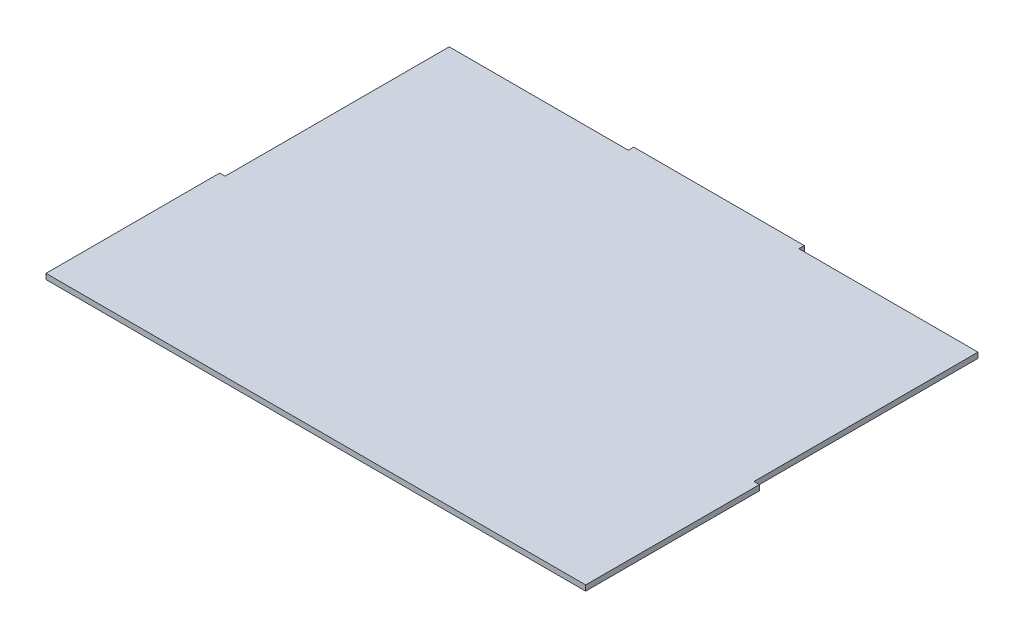
ISO-10303-21;
HEADER;
FILE_DESCRIPTION(('STEP AP214'),'2;1');
FILE_NAME('part.step','',(''),(''),'','','');
FILE_SCHEMA(('AUTOMOTIVE_DESIGN { 1 0 10303 214 1 1 1 1 }'));
ENDSEC;
DATA;
#1=APPLICATION_CONTEXT('core data for automotive mechanical design processes');
#2=APPLICATION_PROTOCOL_DEFINITION('international standard','automotive_design',2000,#1);
#3=PRODUCT_CONTEXT('',#1,'mechanical');
#4=PRODUCT('Part','Part','',(#3));
#5=PRODUCT_RELATED_PRODUCT_CATEGORY('part','',(#4));
#6=PRODUCT_DEFINITION_FORMATION('','',#4);
#7=PRODUCT_DEFINITION_CONTEXT('part definition',#1,'design');
#8=PRODUCT_DEFINITION('design','',#6,#7);
#9=PRODUCT_DEFINITION_SHAPE('','',#8);
#10=(LENGTH_UNIT() NAMED_UNIT(*) SI_UNIT(.MILLI.,.METRE.));
#11=(NAMED_UNIT(*) PLANE_ANGLE_UNIT() SI_UNIT($,.RADIAN.));
#12=(NAMED_UNIT(*) SI_UNIT($,.STERADIAN.) SOLID_ANGLE_UNIT());
#13=UNCERTAINTY_MEASURE_WITH_UNIT(LENGTH_MEASURE(1.E-05),#10,'distance_accuracy_value','');
#14=(GEOMETRIC_REPRESENTATION_CONTEXT(3) GLOBAL_UNCERTAINTY_ASSIGNED_CONTEXT((#13)) GLOBAL_UNIT_ASSIGNED_CONTEXT((#10,
#11,#12)) REPRESENTATION_CONTEXT('',''));
#15=CARTESIAN_POINT('',(0.,0.,0.));
#16=DIRECTION('',(0.,0.,1.));
#17=DIRECTION('',(1.,0.,0.));
#18=AXIS2_PLACEMENT_3D('',#15,#16,#17);
#19=CARTESIAN_POINT('',(0.,0.,0.));
#20=DIRECTION('',(0.,0.,-1.));
#21=DIRECTION('',(-1.,0.,0.));
#22=AXIS2_PLACEMENT_3D('',#19,#20,#21);
#23=PLANE('',#22);
#24=DIRECTION('',(0.,1.,0.));
#25=VECTOR('',#24,1.);
#26=CARTESIAN_POINT('',(-49.84,1.5875,0.));
#27=LINE('',#26,#25);
#28=CARTESIAN_POINT('',(-49.84,-1.5875,0.));
#29=VERTEX_POINT('',#28);
#30=CARTESIAN_POINT('',(-49.84,1.5875,0.));
#31=VERTEX_POINT('',#30);
#32=EDGE_CURVE('E60',#29,#31,#27,.T.);
#33=ORIENTED_EDGE('',*,*,#32,.F.);
#34=DIRECTION('',(1.,0.,0.));
#35=VECTOR('',#34,1.);
#36=CARTESIAN_POINT('',(-157.79,-1.5875,0.));
#37=LINE('',#36,#35);
#38=CARTESIAN_POINT('',(-154.615,-1.5875,0.));
#39=VERTEX_POINT('',#38);
#40=EDGE_CURVE('E202',#39,#29,#37,.T.);
#41=ORIENTED_EDGE('',*,*,#40,.F.);
#42=DIRECTION('',(0.,1.,0.));
#43=VECTOR('',#42,1.);
#44=CARTESIAN_POINT('',(-154.615,-1.5875,0.));
#45=LINE('',#44,#43);
#46=CARTESIAN_POINT('',(-154.615,1.5875,0.));
#47=VERTEX_POINT('',#46);
#48=EDGE_CURVE('E186',#39,#47,#45,.T.);
#49=ORIENTED_EDGE('',*,*,#48,.T.);
#50=DIRECTION('',(-1.,0.,0.));
#51=VECTOR('',#50,1.);
#52=CARTESIAN_POINT('',(-157.79,1.5875,0.));
#53=LINE('',#52,#51);
#54=EDGE_CURVE('E65',#31,#47,#53,.T.);
#55=ORIENTED_EDGE('',*,*,#54,.F.);
#56=EDGE_LOOP('',(#33,#41,#49,#55));
#57=FACE_BOUND('',#56,.T.);
#58=ADVANCED_FACE('F45',(#57),#23,.T.);
#59=CARTESIAN_POINT('',(157.79,-1.5875,232.600000128));
#60=DIRECTION('',(-1.,0.,0.));
#61=DIRECTION('',(0.,0.,1.));
#62=AXIS2_PLACEMENT_3D('',#59,#60,#61);
#63=PLANE('',#62);
#64=DIRECTION('',(0.,1.,0.));
#65=VECTOR('',#64,1.);
#66=CARTESIAN_POINT('',(157.79,-1.5875,130.999992));
#67=LINE('',#66,#65);
#68=CARTESIAN_POINT('',(157.79,-1.5875,130.999992));
#69=VERTEX_POINT('',#68);
#70=CARTESIAN_POINT('',(157.79,1.5875,130.999992));
#71=VERTEX_POINT('',#70);
#72=EDGE_CURVE('E168',#69,#71,#67,.T.);
#73=ORIENTED_EDGE('',*,*,#72,.T.);
#74=DIRECTION('',(0.,0.,-1.));
#75=VECTOR('',#74,1.);
#76=CARTESIAN_POINT('',(157.79,1.5875,232.600000128));
#77=LINE('',#76,#75);
#78=CARTESIAN_POINT('',(157.79,1.5875,232.600000128));
#79=VERTEX_POINT('',#78);
#80=EDGE_CURVE('E11',#79,#71,#77,.T.);
#81=ORIENTED_EDGE('',*,*,#80,.F.);
#82=DIRECTION('',(0.,1.,0.));
#83=VECTOR('',#82,1.);
#84=CARTESIAN_POINT('',(157.79,-1.5875,232.600000128));
#85=LINE('',#84,#83);
#86=CARTESIAN_POINT('',(157.79,-1.5875,232.600000128));
#87=VERTEX_POINT('',#86);
#88=EDGE_CURVE('E198',#87,#79,#85,.T.);
#89=ORIENTED_EDGE('',*,*,#88,.F.);
#90=DIRECTION('',(0.,0.,-1.));
#91=VECTOR('',#90,1.);
#92=CARTESIAN_POINT('',(157.79,-1.5875,232.600000128));
#93=LINE('',#92,#91);
#94=EDGE_CURVE('E208',#87,#69,#93,.T.);
#95=ORIENTED_EDGE('',*,*,#94,.T.);
#96=EDGE_LOOP('',(#73,#81,#89,#95));
#97=FACE_BOUND('',#96,.T.);
#98=ADVANCED_FACE('F47',(#97),#63,.F.);
#99=CARTESIAN_POINT('',(-157.79,1.5875,232.600000128));
#100=DIRECTION('',(0.,-1.,0.));
#101=DIRECTION('',(0.,0.,-1.));
#102=AXIS2_PLACEMENT_3D('',#99,#100,#101);
#103=PLANE('',#102);
#104=DIRECTION('',(1.,0.,0.));
#105=VECTOR('',#104,1.);
#106=CARTESIAN_POINT('',(-157.79,1.5875,130.999992));
#107=LINE('',#106,#105);
#108=CARTESIAN_POINT('',(154.615,1.5875,130.999992));
#109=VERTEX_POINT('',#108);
#110=EDGE_CURVE('E177',#109,#71,#107,.T.);
#111=ORIENTED_EDGE('',*,*,#110,.F.);
#112=DIRECTION('',(0.,0.,1.));
#113=VECTOR('',#112,1.);
#114=CARTESIAN_POINT('',(154.615,1.5875,232.600000128));
#115=LINE('',#114,#113);
#116=CARTESIAN_POINT('',(154.615,1.5875,0.));
#117=VERTEX_POINT('',#116);
#118=EDGE_CURVE('E171',#117,#109,#115,.T.);
#119=ORIENTED_EDGE('',*,*,#118,.F.);
#120=CARTESIAN_POINT('',(49.84,1.5875,0.));
#121=VERTEX_POINT('',#120);
#122=EDGE_CURVE('E209',#117,#121,#53,.T.);
#123=ORIENTED_EDGE('',*,*,#122,.T.);
#124=DIRECTION('',(0.,0.,1.));
#125=VECTOR('',#124,1.);
#126=CARTESIAN_POINT('',(49.84,1.5875,-3.175));
#127=LINE('',#126,#125);
#128=CARTESIAN_POINT('',(49.84,1.5875,-3.175));
#129=VERTEX_POINT('',#128);
#130=EDGE_CURVE('E141',#129,#121,#127,.T.);
#131=ORIENTED_EDGE('',*,*,#130,.F.);
#132=DIRECTION('',(1.,0.,0.));
#133=VECTOR('',#132,1.);
#134=CARTESIAN_POINT('',(-49.84,1.5875,-3.175));
#135=LINE('',#134,#133);
#136=CARTESIAN_POINT('',(-49.84,1.5875,-3.175));
#137=VERTEX_POINT('',#136);
#138=EDGE_CURVE('E133',#137,#129,#135,.T.);
#139=ORIENTED_EDGE('',*,*,#138,.F.);
#140=DIRECTION('',(0.,0.,1.));
#141=VECTOR('',#140,1.);
#142=CARTESIAN_POINT('',(-49.84,1.5875,-3.175));
#143=LINE('',#142,#141);
#144=EDGE_CURVE('E138',#137,#31,#143,.T.);
#145=ORIENTED_EDGE('',*,*,#144,.T.);
#146=ORIENTED_EDGE('',*,*,#54,.T.);
#147=DIRECTION('',(0.,0.,1.));
#148=VECTOR('',#147,1.);
#149=CARTESIAN_POINT('',(-154.615,1.5875,232.600000128));
#150=LINE('',#149,#148);
#151=CARTESIAN_POINT('',(-154.615,1.5875,130.999992));
#152=VERTEX_POINT('',#151);
#153=EDGE_CURVE('E188',#47,#152,#150,.T.);
#154=ORIENTED_EDGE('',*,*,#153,.T.);
#155=DIRECTION('',(-1.,0.,0.));
#156=VECTOR('',#155,1.);
#157=CARTESIAN_POINT('',(-157.79,1.5875,130.999992));
#158=LINE('',#157,#156);
#159=CARTESIAN_POINT('',(-157.79,1.5875,130.999992));
#160=VERTEX_POINT('',#159);
#161=EDGE_CURVE('E195',#152,#160,#158,.T.);
#162=ORIENTED_EDGE('',*,*,#161,.T.);
#163=DIRECTION('',(0.,0.,-1.));
#164=VECTOR('',#163,1.);
#165=CARTESIAN_POINT('',(-157.79,1.5875,232.600000128));
#166=LINE('',#165,#164);
#167=CARTESIAN_POINT('',(-157.79,1.5875,232.600000128));
#168=VERTEX_POINT('',#167);
#169=EDGE_CURVE('E53',#168,#160,#166,.T.);
#170=ORIENTED_EDGE('',*,*,#169,.F.);
#171=DIRECTION('',(-1.,0.,0.));
#172=VECTOR('',#171,1.);
#173=CARTESIAN_POINT('',(-157.79,1.5875,232.600000128));
#174=LINE('',#173,#172);
#175=EDGE_CURVE('E201',#79,#168,#174,.T.);
#176=ORIENTED_EDGE('',*,*,#175,.F.);
#177=ORIENTED_EDGE('',*,*,#80,.T.);
#178=EDGE_LOOP('',(#111,#119,#123,#131,#139,#145,#146,#154,#162,#170,#176,#177));
#179=FACE_BOUND('',#178,.T.);
#180=ADVANCED_FACE('F136',(#179),#103,.F.);
#181=CARTESIAN_POINT('',(-157.79,-1.5875,232.600000128));
#182=DIRECTION('',(0.,1.,0.));
#183=DIRECTION('',(0.,0.,1.));
#184=AXIS2_PLACEMENT_3D('',#181,#182,#183);
#185=PLANE('',#184);
#186=DIRECTION('',(-1.,0.,0.));
#187=VECTOR('',#186,1.);
#188=CARTESIAN_POINT('',(157.79,-1.5875,130.999992));
#189=LINE('',#188,#187);
#190=CARTESIAN_POINT('',(154.615,-1.5875,130.999992));
#191=VERTEX_POINT('',#190);
#192=EDGE_CURVE('E160',#69,#191,#189,.T.);
#193=ORIENTED_EDGE('',*,*,#192,.F.);
#194=ORIENTED_EDGE('',*,*,#94,.F.);
#195=DIRECTION('',(1.,0.,0.));
#196=VECTOR('',#195,1.);
#197=CARTESIAN_POINT('',(-157.79,-1.5875,232.600000128));
#198=LINE('',#197,#196);
#199=CARTESIAN_POINT('',(-157.79,-1.5875,232.600000128));
#200=VERTEX_POINT('',#199);
#201=EDGE_CURVE('E206',#200,#87,#198,.T.);
#202=ORIENTED_EDGE('',*,*,#201,.F.);
#203=DIRECTION('',(0.,0.,-1.));
#204=VECTOR('',#203,1.);
#205=CARTESIAN_POINT('',(-157.79,-1.5875,232.600000128));
#206=LINE('',#205,#204);
#207=CARTESIAN_POINT('',(-157.79,-1.5875,130.999992));
#208=VERTEX_POINT('',#207);
#209=EDGE_CURVE('E215',#200,#208,#206,.T.);
#210=ORIENTED_EDGE('',*,*,#209,.T.);
#211=DIRECTION('',(1.,0.,0.));
#212=VECTOR('',#211,1.);
#213=CARTESIAN_POINT('',(-157.79,-1.5875,130.999992));
#214=LINE('',#213,#212);
#215=CARTESIAN_POINT('',(-154.615,-1.5875,130.999992));
#216=VERTEX_POINT('',#215);
#217=EDGE_CURVE('E179',#208,#216,#214,.T.);
#218=ORIENTED_EDGE('',*,*,#217,.T.);
#219=DIRECTION('',(0.,0.,-1.));
#220=VECTOR('',#219,1.);
#221=CARTESIAN_POINT('',(-154.615,-1.5875,0.));
#222=LINE('',#221,#220);
#223=EDGE_CURVE('E182',#216,#39,#222,.T.);
#224=ORIENTED_EDGE('',*,*,#223,.T.);
#225=ORIENTED_EDGE('',*,*,#40,.T.);
#226=DIRECTION('',(0.,0.,1.));
#227=VECTOR('',#226,1.);
#228=CARTESIAN_POINT('',(-49.84,-1.5875,-3.175));
#229=LINE('',#228,#227);
#230=CARTESIAN_POINT('',(-49.84,-1.5875,-3.175));
#231=VERTEX_POINT('',#230);
#232=EDGE_CURVE('E260',#231,#29,#229,.T.);
#233=ORIENTED_EDGE('',*,*,#232,.F.);
#234=DIRECTION('',(-1.,0.,0.));
#235=VECTOR('',#234,1.);
#236=CARTESIAN_POINT('',(-49.84,-1.5875,-3.175));
#237=LINE('',#236,#235);
#238=CARTESIAN_POINT('',(49.84,-1.5875,-3.175));
#239=VERTEX_POINT('',#238);
#240=EDGE_CURVE('E150',#239,#231,#237,.T.);
#241=ORIENTED_EDGE('',*,*,#240,.F.);
#242=DIRECTION('',(0.,0.,1.));
#243=VECTOR('',#242,1.);
#244=CARTESIAN_POINT('',(49.84,-1.5875,-3.175));
#245=LINE('',#244,#243);
#246=CARTESIAN_POINT('',(49.84,-1.5875,0.));
#247=VERTEX_POINT('',#246);
#248=EDGE_CURVE('E162',#239,#247,#245,.T.);
#249=ORIENTED_EDGE('',*,*,#248,.T.);
#250=CARTESIAN_POINT('',(154.615,-1.5875,0.));
#251=VERTEX_POINT('',#250);
#252=EDGE_CURVE('E211',#247,#251,#37,.T.);
#253=ORIENTED_EDGE('',*,*,#252,.T.);
#254=DIRECTION('',(0.,0.,-1.));
#255=VECTOR('',#254,1.);
#256=CARTESIAN_POINT('',(154.615,-1.5875,0.));
#257=LINE('',#256,#255);
#258=EDGE_CURVE('E157',#191,#251,#257,.T.);
#259=ORIENTED_EDGE('',*,*,#258,.F.);
#260=EDGE_LOOP('',(#193,#194,#202,#210,#218,#224,#225,#233,#241,#249,#253,#259));
#261=FACE_BOUND('',#260,.T.);
#262=ADVANCED_FACE('F232',(#261),#185,.F.);
#263=DIRECTION('',(0.,-1.,0.));
#264=VECTOR('',#263,1.);
#265=CARTESIAN_POINT('',(49.84,1.5875,0.));
#266=LINE('',#265,#264);
#267=EDGE_CURVE('E154',#121,#247,#266,.T.);
#268=ORIENTED_EDGE('',*,*,#267,.F.);
#269=ORIENTED_EDGE('',*,*,#122,.F.);
#270=DIRECTION('',(0.,1.,0.));
#271=VECTOR('',#270,1.);
#272=CARTESIAN_POINT('',(154.615,-1.5875,0.));
#273=LINE('',#272,#271);
#274=EDGE_CURVE('E167',#251,#117,#273,.T.);
#275=ORIENTED_EDGE('',*,*,#274,.F.);
#276=ORIENTED_EDGE('',*,*,#252,.F.);
#277=EDGE_LOOP('',(#268,#269,#275,#276));
#278=FACE_BOUND('',#277,.T.);
#279=ADVANCED_FACE('F253',(#278),#23,.T.);
#280=CARTESIAN_POINT('',(-157.79,-1.5875,232.600000128));
#281=DIRECTION('',(1.,0.,0.));
#282=DIRECTION('',(0.,0.,-1.));
#283=AXIS2_PLACEMENT_3D('',#280,#281,#282);
#284=PLANE('',#283);
#285=ORIENTED_EDGE('',*,*,#169,.T.);
#286=DIRECTION('',(0.,1.,0.));
#287=VECTOR('',#286,1.);
#288=CARTESIAN_POINT('',(-157.79,-1.5875,130.999992));
#289=LINE('',#288,#287);
#290=EDGE_CURVE('E185',#208,#160,#289,.T.);
#291=ORIENTED_EDGE('',*,*,#290,.F.);
#292=ORIENTED_EDGE('',*,*,#209,.F.);
#293=DIRECTION('',(0.,-1.,0.));
#294=VECTOR('',#293,1.);
#295=CARTESIAN_POINT('',(-157.79,-1.5875,232.600000128));
#296=LINE('',#295,#294);
#297=EDGE_CURVE('E204',#168,#200,#296,.T.);
#298=ORIENTED_EDGE('',*,*,#297,.F.);
#299=EDGE_LOOP('',(#285,#291,#292,#298));
#300=FACE_BOUND('',#299,.T.);
#301=ADVANCED_FACE('F222',(#300),#284,.F.);
#302=CARTESIAN_POINT('',(0.,0.,232.600000128));
#303=DIRECTION('',(0.,0.,-1.));
#304=DIRECTION('',(-1.,0.,0.));
#305=AXIS2_PLACEMENT_3D('',#302,#303,#304);
#306=PLANE('',#305);
#307=ORIENTED_EDGE('',*,*,#88,.T.);
#308=ORIENTED_EDGE('',*,*,#175,.T.);
#309=ORIENTED_EDGE('',*,*,#297,.T.);
#310=ORIENTED_EDGE('',*,*,#201,.T.);
#311=EDGE_LOOP('',(#307,#308,#309,#310));
#312=FACE_BOUND('',#311,.T.);
#313=ADVANCED_FACE('F237',(#312),#306,.F.);
#314=CARTESIAN_POINT('',(-157.79,-1.5875,130.999992));
#315=DIRECTION('',(0.,0.,1.));
#316=DIRECTION('',(1.,0.,0.));
#317=AXIS2_PLACEMENT_3D('',#314,#315,#316);
#318=PLANE('',#317);
#319=DIRECTION('',(0.,1.,0.));
#320=VECTOR('',#319,1.);
#321=CARTESIAN_POINT('',(-154.615,-1.5875,130.999992));
#322=LINE('',#321,#320);
#323=EDGE_CURVE('E189',#216,#152,#322,.T.);
#324=ORIENTED_EDGE('',*,*,#323,.F.);
#325=ORIENTED_EDGE('',*,*,#217,.F.);
#326=ORIENTED_EDGE('',*,*,#290,.T.);
#327=ORIENTED_EDGE('',*,*,#161,.F.);
#328=EDGE_LOOP('',(#324,#325,#326,#327));
#329=FACE_BOUND('',#328,.T.);
#330=ADVANCED_FACE('F226',(#329),#318,.F.);
#331=CARTESIAN_POINT('',(-154.615,-1.5875,0.));
#332=DIRECTION('',(1.,0.,0.));
#333=DIRECTION('',(0.,0.,-1.));
#334=AXIS2_PLACEMENT_3D('',#331,#332,#333);
#335=PLANE('',#334);
#336=ORIENTED_EDGE('',*,*,#48,.F.);
#337=ORIENTED_EDGE('',*,*,#223,.F.);
#338=ORIENTED_EDGE('',*,*,#323,.T.);
#339=ORIENTED_EDGE('',*,*,#153,.F.);
#340=EDGE_LOOP('',(#336,#337,#338,#339));
#341=FACE_BOUND('',#340,.T.);
#342=ADVANCED_FACE('F229',(#341),#335,.F.);
#343=CARTESIAN_POINT('',(157.79,-1.5875,130.999992));
#344=DIRECTION('',(0.,0.,-1.));
#345=DIRECTION('',(-1.,0.,0.));
#346=AXIS2_PLACEMENT_3D('',#343,#344,#345);
#347=PLANE('',#346);
#348=ORIENTED_EDGE('',*,*,#110,.T.);
#349=ORIENTED_EDGE('',*,*,#72,.F.);
#350=ORIENTED_EDGE('',*,*,#192,.T.);
#351=DIRECTION('',(0.,1.,0.));
#352=VECTOR('',#351,1.);
#353=CARTESIAN_POINT('',(154.615,-1.5875,130.999992));
#354=LINE('',#353,#352);
#355=EDGE_CURVE('E172',#191,#109,#354,.T.);
#356=ORIENTED_EDGE('',*,*,#355,.T.);
#357=EDGE_LOOP('',(#348,#349,#350,#356));
#358=FACE_BOUND('',#357,.T.);
#359=ADVANCED_FACE('F243',(#358),#347,.T.);
#360=CARTESIAN_POINT('',(154.615,-1.5875,0.));
#361=DIRECTION('',(1.,0.,0.));
#362=DIRECTION('',(0.,0.,-1.));
#363=AXIS2_PLACEMENT_3D('',#360,#361,#362);
#364=PLANE('',#363);
#365=ORIENTED_EDGE('',*,*,#118,.T.);
#366=ORIENTED_EDGE('',*,*,#355,.F.);
#367=ORIENTED_EDGE('',*,*,#258,.T.);
#368=ORIENTED_EDGE('',*,*,#274,.T.);
#369=EDGE_LOOP('',(#365,#366,#367,#368));
#370=FACE_BOUND('',#369,.T.);
#371=ADVANCED_FACE('F247',(#370),#364,.T.);
#372=CARTESIAN_POINT('',(-49.84,1.5875,-3.175));
#373=DIRECTION('',(1.,0.,0.));
#374=DIRECTION('',(0.,0.,-1.));
#375=AXIS2_PLACEMENT_3D('',#372,#373,#374);
#376=PLANE('',#375);
#377=ORIENTED_EDGE('',*,*,#32,.T.);
#378=ORIENTED_EDGE('',*,*,#144,.F.);
#379=DIRECTION('',(0.,1.,0.));
#380=VECTOR('',#379,1.);
#381=CARTESIAN_POINT('',(-49.84,1.5875,-3.175));
#382=LINE('',#381,#380);
#383=EDGE_CURVE('E145',#231,#137,#382,.T.);
#384=ORIENTED_EDGE('',*,*,#383,.F.);
#385=ORIENTED_EDGE('',*,*,#232,.T.);
#386=EDGE_LOOP('',(#377,#378,#384,#385));
#387=FACE_BOUND('',#386,.T.);
#388=ADVANCED_FACE('F156',(#387),#376,.F.);
#389=CARTESIAN_POINT('',(49.84,1.5875,-3.175));
#390=DIRECTION('',(-1.,0.,0.));
#391=DIRECTION('',(0.,0.,1.));
#392=AXIS2_PLACEMENT_3D('',#389,#390,#391);
#393=PLANE('',#392);
#394=ORIENTED_EDGE('',*,*,#267,.T.);
#395=ORIENTED_EDGE('',*,*,#248,.F.);
#396=DIRECTION('',(0.,-1.,0.));
#397=VECTOR('',#396,1.);
#398=CARTESIAN_POINT('',(49.84,1.5875,-3.175));
#399=LINE('',#398,#397);
#400=EDGE_CURVE('E144',#129,#239,#399,.T.);
#401=ORIENTED_EDGE('',*,*,#400,.F.);
#402=ORIENTED_EDGE('',*,*,#130,.T.);
#403=EDGE_LOOP('',(#394,#395,#401,#402));
#404=FACE_BOUND('',#403,.T.);
#405=ADVANCED_FACE('F255',(#404),#393,.F.);
#406=CARTESIAN_POINT('',(0.,0.,-3.175));
#407=DIRECTION('',(0.,0.,1.));
#408=DIRECTION('',(1.,0.,0.));
#409=AXIS2_PLACEMENT_3D('',#406,#407,#408);
#410=PLANE('',#409);
#411=ORIENTED_EDGE('',*,*,#383,.T.);
#412=ORIENTED_EDGE('',*,*,#138,.T.);
#413=ORIENTED_EDGE('',*,*,#400,.T.);
#414=ORIENTED_EDGE('',*,*,#240,.T.);
#415=EDGE_LOOP('',(#411,#412,#413,#414));
#416=FACE_BOUND('',#415,.T.);
#417=ADVANCED_FACE('F148',(#416),#410,.F.);
#418=CLOSED_SHELL('',(#58,#98,#180,#262,#279,#301,#313,#330,#342,#359,#371,#388,#405,#417));
#419=MANIFOLD_SOLID_BREP('B2',#418);
#420=ADVANCED_BREP_SHAPE_REPRESENTATION('',(#18,#419),#14);
#421=SHAPE_DEFINITION_REPRESENTATION(#9,#420);
ENDSEC;
END-ISO-10303-21;
